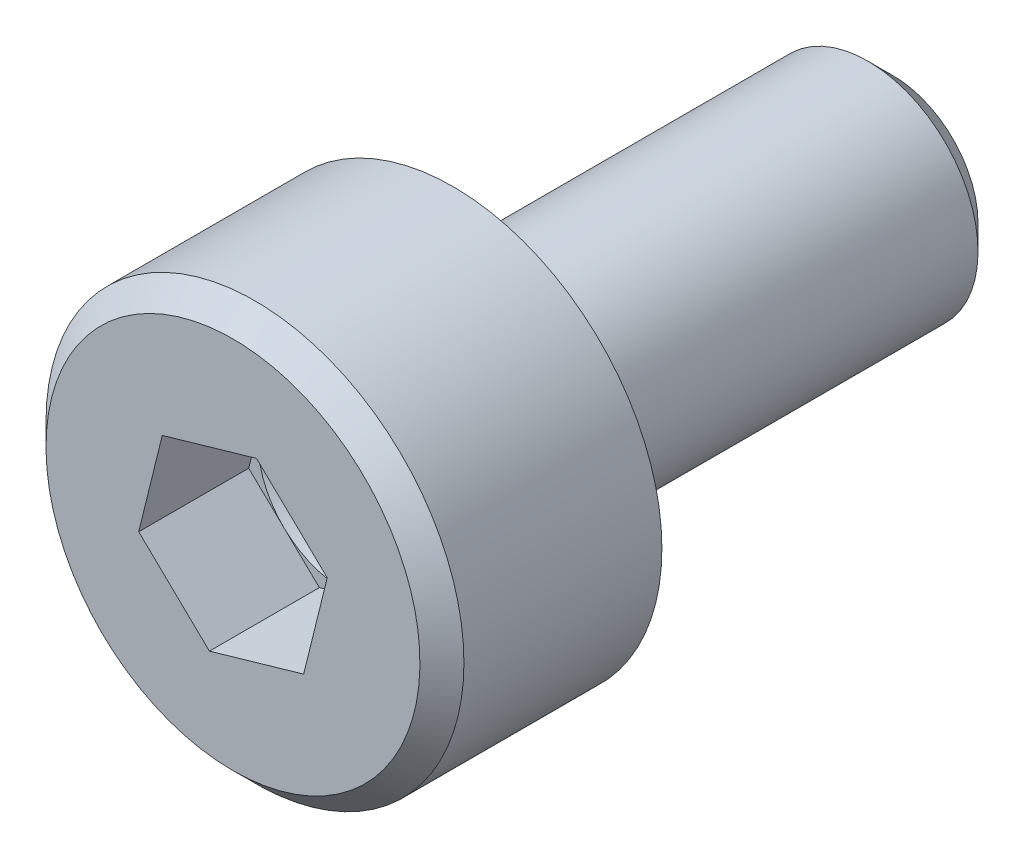
ISO-10303-21;
HEADER;
FILE_DESCRIPTION(('STEP AP214'),'2;1');
FILE_NAME('part.step','',(''),(''),'','','');
FILE_SCHEMA(('AUTOMOTIVE_DESIGN { 1 0 10303 214 1 1 1 1 }'));
ENDSEC;
DATA;
#1=APPLICATION_CONTEXT('core data for automotive mechanical design processes');
#2=APPLICATION_PROTOCOL_DEFINITION('international standard','automotive_design',2000,#1);
#3=PRODUCT_CONTEXT('',#1,'mechanical');
#4=PRODUCT('Part','Part','',(#3));
#5=PRODUCT_RELATED_PRODUCT_CATEGORY('part','',(#4));
#6=PRODUCT_DEFINITION_FORMATION('','',#4);
#7=PRODUCT_DEFINITION_CONTEXT('part definition',#1,'design');
#8=PRODUCT_DEFINITION('design','',#6,#7);
#9=PRODUCT_DEFINITION_SHAPE('','',#8);
#10=(LENGTH_UNIT() NAMED_UNIT(*) SI_UNIT(.MILLI.,.METRE.));
#11=(NAMED_UNIT(*) PLANE_ANGLE_UNIT() SI_UNIT($,.RADIAN.));
#12=(NAMED_UNIT(*) SI_UNIT($,.STERADIAN.) SOLID_ANGLE_UNIT());
#13=UNCERTAINTY_MEASURE_WITH_UNIT(LENGTH_MEASURE(1.E-05),#10,'distance_accuracy_value','');
#14=(GEOMETRIC_REPRESENTATION_CONTEXT(3) GLOBAL_UNCERTAINTY_ASSIGNED_CONTEXT((#13)) GLOBAL_UNIT_ASSIGNED_CONTEXT((#10,
#11,#12)) REPRESENTATION_CONTEXT('',''));
#15=CARTESIAN_POINT('',(0.,0.,0.));
#16=DIRECTION('',(0.,0.,1.));
#17=DIRECTION('',(1.,0.,0.));
#18=AXIS2_PLACEMENT_3D('',#15,#16,#17);
#19=CARTESIAN_POINT('',(15.2383327942925,-4.87782878444803,9.1));
#20=DIRECTION('',(0.,0.,-1.));
#21=DIRECTION('',(0.,1.,0.));
#22=AXIS2_PLACEMENT_3D('',#19,#20,#21);
#23=TOROIDAL_SURFACE('',#22,1.10000000000004,0.100000000000027);
#24=CARTESIAN_POINT('',(15.2383327942925,-4.87782878444803,9.2));
#25=DIRECTION('',(0.,0.,1.));
#26=DIRECTION('',(0.,1.,0.));
#27=AXIS2_PLACEMENT_3D('',#24,#25,#26);
#28=CIRCLE('',#27,1.1);
#29=CARTESIAN_POINT('',(16.3061327451744,-5.14203185955639,9.2));
#30=VERTEX_POINT('',#29);
#31=CARTESIAN_POINT('',(14.1705328434106,-4.61362570933967,9.2));
#32=VERTEX_POINT('',#31);
#33=EDGE_CURVE('E272',#30,#32,#28,.T.);
#34=ORIENTED_EDGE('',*,*,#33,.F.);
#35=CARTESIAN_POINT('',(16.3061327451744,-5.14203185955639,9.1));
#36=DIRECTION('',(-0.240184613734874,-0.970727228074411,0.));
#37=DIRECTION('',(0.970727228074411,-0.240184613734874,0.));
#38=AXIS2_PLACEMENT_3D('',#35,#36,#37);
#39=CIRCLE('',#38,0.1);
#40=CARTESIAN_POINT('',(16.2090600223669,-5.1180133981829,9.1));
#41=VERTEX_POINT('',#40);
#42=EDGE_CURVE('E279',#30,#41,#39,.T.);
#43=ORIENTED_EDGE('',*,*,#42,.T.);
#44=CARTESIAN_POINT('',(15.2383327942925,-4.87782878444803,9.1));
#45=DIRECTION('',(0.,0.,-1.));
#46=DIRECTION('',(0.97072722807441,-0.240184613734876,0.));
#47=AXIS2_PLACEMENT_3D('',#44,#45,#46);
#48=CIRCLE('',#47,1.);
#49=CARTESIAN_POINT('',(14.2676055662181,-4.63764417071315,9.1));
#50=VERTEX_POINT('',#49);
#51=EDGE_CURVE('E11',#50,#41,#48,.T.);
#52=ORIENTED_EDGE('',*,*,#51,.F.);
#53=CARTESIAN_POINT('',(14.1705328434106,-4.61362570933967,9.1));
#54=DIRECTION('',(0.240184613734878,0.97072722807441,0.));
#55=DIRECTION('',(-0.97072722807441,0.240184613734878,0.));
#56=AXIS2_PLACEMENT_3D('',#53,#54,#55);
#57=CIRCLE('',#56,0.1);
#58=EDGE_CURVE('E199',#32,#50,#57,.T.);
#59=ORIENTED_EDGE('',*,*,#58,.F.);
#60=EDGE_LOOP('',(#34,#43,#52,#59));
#61=FACE_BOUND('',#60,.T.);
#62=ADVANCED_FACE('F16',(#61),#23,.F.);
#63=CARTESIAN_POINT('',(15.2383327942925,-4.87782878444803,42.95));
#64=DIRECTION('',(0.,0.,1.));
#65=DIRECTION('',(0.97072722807441,-0.240184613734876,0.));
#66=AXIS2_PLACEMENT_3D('',#63,#64,#65);
#67=CYLINDRICAL_SURFACE('',#66,1.);
#68=CARTESIAN_POINT('',(15.2383327942925,-4.87782878444803,5.426));
#69=DIRECTION('',(0.,0.,1.));
#70=DIRECTION('',(0.97072722807441,-0.240184613734876,0.));
#71=AXIS2_PLACEMENT_3D('',#68,#69,#70);
#72=CIRCLE('',#71,1.);
#73=CARTESIAN_POINT('',(16.2090600223669,-5.11801339818291,5.426));
#74=VERTEX_POINT('',#73);
#75=EDGE_CURVE('E19',#74,#74,#72,.T.);
#76=ORIENTED_EDGE('',*,*,#75,.T.);
#77=EDGE_LOOP('',(#76));
#78=FACE_BOUND('',#77,.T.);
#79=ORIENTED_EDGE('',*,*,#51,.T.);
#80=CARTESIAN_POINT('',(15.2383327942925,-4.87782878444803,9.1));
#81=DIRECTION('',(0.,0.,-1.));
#82=DIRECTION('',(0.97072722807441,-0.240184613734876,0.));
#83=AXIS2_PLACEMENT_3D('',#80,#81,#82);
#84=CIRCLE('',#83,1.);
#85=EDGE_CURVE('E194',#41,#50,#84,.T.);
#86=ORIENTED_EDGE('',*,*,#85,.T.);
#87=EDGE_LOOP('',(#79,#86));
#88=FACE_BOUND('',#87,.T.);
#89=ADVANCED_FACE('F508',(#78,#88),#67,.T.);
#90=CARTESIAN_POINT('',(15.2383327942925,-4.87782878444803,5.42599999991234));
#91=DIRECTION('',(0.,0.,1.));
#92=DIRECTION('',(0.970727228074411,-0.240184613734875,0.));
#93=AXIS2_PLACEMENT_3D('',#90,#91,#92);
#94=CONICAL_SURFACE('',#93,0.999999999919511,0.785398163397448);
#95=CARTESIAN_POINT('',(15.2383327942925,-4.87782878444803,5.19999999997134));
#96=DIRECTION('',(0.,0.,1.));
#97=DIRECTION('',(0.97072722807441,-0.240184613734876,0.));
#98=AXIS2_PLACEMENT_3D('',#95,#96,#97);
#99=CIRCLE('',#98,0.773999999978514);
#100=CARTESIAN_POINT('',(15.9896756688012,-5.06373167547366,5.19999999997134));
#101=VERTEX_POINT('',#100);
#102=EDGE_CURVE('E265',#101,#101,#99,.T.);
#103=ORIENTED_EDGE('',*,*,#102,.T.);
#104=EDGE_LOOP('',(#103));
#105=FACE_BOUND('',#104,.T.);
#106=ORIENTED_EDGE('',*,*,#75,.F.);
#107=EDGE_LOOP('',(#106));
#108=FACE_BOUND('',#107,.T.);
#109=ADVANCED_FACE('F498',(#105,#108),#94,.T.);
#110=CARTESIAN_POINT('',(15.2383327942925,-4.87782878444803,42.95));
#111=DIRECTION('',(0.,0.,1.));
#112=DIRECTION('',(0.97072722807441,-0.240184613734876,0.));
#113=AXIS2_PLACEMENT_3D('',#110,#111,#112);
#114=CYLINDRICAL_SURFACE('',#113,1.9);
#115=CARTESIAN_POINT('',(15.2383327942925,-4.87782878444803,9.2));
#116=DIRECTION('',(0.,0.,-1.));
#117=DIRECTION('',(0.97072722807441,-0.240184613734876,0.));
#118=AXIS2_PLACEMENT_3D('',#115,#116,#117);
#119=CIRCLE('',#118,1.9);
#120=CARTESIAN_POINT('',(17.0827145276339,-5.33417955054429,9.2));
#121=VERTEX_POINT('',#120);
#122=EDGE_CURVE('E276',#121,#121,#119,.T.);
#123=ORIENTED_EDGE('',*,*,#122,.F.);
#124=EDGE_LOOP('',(#123));
#125=FACE_BOUND('',#124,.T.);
#126=CARTESIAN_POINT('',(15.2383327942925,-4.87782878444803,11.));
#127=DIRECTION('',(0.,0.,-1.));
#128=DIRECTION('',(0.97072722807441,-0.240184613734876,0.));
#129=AXIS2_PLACEMENT_3D('',#126,#127,#128);
#130=CIRCLE('',#129,1.9);
#131=CARTESIAN_POINT('',(17.0827145276339,-5.33417955054429,11.));
#132=VERTEX_POINT('',#131);
#133=EDGE_CURVE('E198',#132,#132,#130,.T.);
#134=ORIENTED_EDGE('',*,*,#133,.T.);
#135=EDGE_LOOP('',(#134));
#136=FACE_BOUND('',#135,.T.);
#137=ADVANCED_FACE('F487',(#125,#136),#114,.T.);
#138=CARTESIAN_POINT('',(15.2383327942925,-4.87782878444803,10.9999999999933));
#139=DIRECTION('',(0.,0.,-1.));
#140=DIRECTION('',(-0.97072722807441,0.240184613734876,0.));
#141=AXIS2_PLACEMENT_3D('',#138,#139,#140);
#142=CONICAL_SURFACE('',#141,1.89999999997781,0.78539816325534);
#143=CARTESIAN_POINT('',(15.2383327942925,-4.87782878444803,11.2000000000568));
#144=DIRECTION('',(0.,0.,-1.));
#145=DIRECTION('',(-0.97072722807441,0.240184613734876,0.));
#146=AXIS2_PLACEMENT_3D('',#143,#144,#145);
#147=CIRCLE('',#146,1.69999999997117);
#148=CARTESIAN_POINT('',(13.588096506594,-4.46951494110567,11.2000000000568));
#149=VERTEX_POINT('',#148);
#150=EDGE_CURVE('E262',#149,#149,#147,.T.);
#151=ORIENTED_EDGE('',*,*,#150,.T.);
#152=EDGE_LOOP('',(#151));
#153=FACE_BOUND('',#152,.T.);
#154=ORIENTED_EDGE('',*,*,#133,.F.);
#155=EDGE_LOOP('',(#154));
#156=FACE_BOUND('',#155,.T.);
#157=ADVANCED_FACE('F477',(#153,#156),#142,.T.);
#158=CARTESIAN_POINT('',(15.2383327942925,-4.87782878444803,10.1999999999668));
#159=DIRECTION('',(0.,0.,1.));
#160=DIRECTION('',(0.970727228074411,-0.240184613734875,0.));
#161=AXIS2_PLACEMENT_3D('',#158,#159,#160);
#162=CONICAL_SURFACE('',#161,0.772499999868614,1.04719755118058);
#163=CARTESIAN_POINT('',(15.2383327944028,-4.87782878447533,9.75399691705314));
#164=VERTEX_POINT('',#163);
#165=VERTEX_LOOP('',#164);
#166=FACE_BOUND('',#165,.T.);
#167=CARTESIAN_POINT('',(15.2383327942925,-4.87782878444803,10.2000000000324));
#168=DIRECTION('',(0.,0.,1.));
#169=DIRECTION('',(0.97072722807441,-0.240184613734876,0.));
#170=AXIS2_PLACEMENT_3D('',#167,#168,#169);
#171=CIRCLE('',#170,0.772499999982302);
#172=CARTESIAN_POINT('',(15.0240740197552,-4.13563647276587,10.2000000000162));
#173=VERTEX_POINT('',#172);
#174=CARTESIAN_POINT('',(14.4884460106367,-4.69228617034644,10.2000000000079));
#175=VERTEX_POINT('',#174);
#176=EDGE_CURVE('E156',#173,#175,#171,.T.);
#177=ORIENTED_EDGE('',*,*,#176,.T.);
#178=CARTESIAN_POINT('',(15.2383327942925,-4.87782878444803,10.2000000000324));
#179=DIRECTION('',(0.,0.,1.));
#180=DIRECTION('',(0.97072722807441,-0.240184613734876,0.));
#181=AXIS2_PLACEMENT_3D('',#178,#179,#180);
#182=CIRCLE('',#181,0.772499999982302);
#183=CARTESIAN_POINT('',(14.7027047851509,-5.43447848202212,10.2000000000162));
#184=VERTEX_POINT('',#183);
#185=EDGE_CURVE('E148',#175,#184,#182,.T.);
#186=ORIENTED_EDGE('',*,*,#185,.T.);
#187=CARTESIAN_POINT('',(15.2383327942925,-4.87782878444803,10.2000000000324));
#188=DIRECTION('',(0.,0.,1.));
#189=DIRECTION('',(0.97072722807441,-0.240184613734876,0.));
#190=AXIS2_PLACEMENT_3D('',#187,#188,#189);
#191=CIRCLE('',#190,0.772499999982302);
#192=CARTESIAN_POINT('',(15.4525915688298,-5.62002109613019,10.2000000000162));
#193=VERTEX_POINT('',#192);
#194=EDGE_CURVE('E152',#184,#193,#191,.T.);
#195=ORIENTED_EDGE('',*,*,#194,.T.);
#196=CARTESIAN_POINT('',(15.2383327942925,-4.87782878444803,10.2000000000324));
#197=DIRECTION('',(0.,0.,1.));
#198=DIRECTION('',(0.97072722807441,-0.240184613734876,0.));
#199=AXIS2_PLACEMENT_3D('',#196,#197,#198);
#200=CIRCLE('',#199,0.772499999982302);
#201=CARTESIAN_POINT('',(15.9882195779481,-5.06337139855033,10.2000000000079));
#202=VERTEX_POINT('',#201);
#203=EDGE_CURVE('E587',#193,#202,#200,.T.);
#204=ORIENTED_EDGE('',*,*,#203,.T.);
#205=CARTESIAN_POINT('',(15.2383327942925,-4.87782878444803,10.2000000000324));
#206=DIRECTION('',(0.,0.,1.));
#207=DIRECTION('',(0.97072722807441,-0.240184613734876,0.));
#208=AXIS2_PLACEMENT_3D('',#205,#206,#207);
#209=CIRCLE('',#208,0.772499999982302);
#210=CARTESIAN_POINT('',(15.7739608034341,-4.32117908687393,10.2000000000162));
#211=VERTEX_POINT('',#210);
#212=EDGE_CURVE('E577',#202,#211,#209,.T.);
#213=ORIENTED_EDGE('',*,*,#212,.T.);
#214=CARTESIAN_POINT('',(15.2383327942925,-4.87782878444803,10.2000000000324));
#215=DIRECTION('',(0.,0.,1.));
#216=DIRECTION('',(0.97072722807441,-0.240184613734876,0.));
#217=AXIS2_PLACEMENT_3D('',#214,#215,#216);
#218=CIRCLE('',#217,0.772499999982302);
#219=EDGE_CURVE('E214',#211,#173,#218,.T.);
#220=ORIENTED_EDGE('',*,*,#219,.T.);
#221=EDGE_LOOP('',(#177,#186,#195,#204,#213,#220));
#222=FACE_BOUND('',#221,.T.);
#223=ADVANCED_FACE('F150',(#166,#222),#162,.F.);
#224=CARTESIAN_POINT('',(15.2383327942925,-4.87782878444803,9.1));
#225=DIRECTION('',(0.,0.,-1.));
#226=DIRECTION('',(0.,1.,0.));
#227=AXIS2_PLACEMENT_3D('',#224,#225,#226);
#228=TOROIDAL_SURFACE('',#227,1.10000000000004,0.100000000000037);
#229=ORIENTED_EDGE('',*,*,#42,.F.);
#230=CARTESIAN_POINT('',(15.2383327942925,-4.87782878444803,9.2));
#231=DIRECTION('',(0.,0.,1.));
#232=DIRECTION('',(-1.,0.,0.));
#233=AXIS2_PLACEMENT_3D('',#230,#231,#232);
#234=CIRCLE('',#233,1.1);
#235=EDGE_CURVE('E268',#32,#30,#234,.T.);
#236=ORIENTED_EDGE('',*,*,#235,.F.);
#237=ORIENTED_EDGE('',*,*,#58,.T.);
#238=ORIENTED_EDGE('',*,*,#85,.F.);
#239=EDGE_LOOP('',(#229,#236,#237,#238));
#240=FACE_BOUND('',#239,.T.);
#241=ADVANCED_FACE('F458',(#240),#228,.F.);
#242=CARTESIAN_POINT('',(15.6946835603888,-3.03344705110665,9.2));
#243=DIRECTION('',(0.,0.,-1.));
#244=DIRECTION('',(0.,-1.,0.));
#245=AXIS2_PLACEMENT_3D('',#242,#243,#244);
#246=PLANE('',#245);
#247=ORIENTED_EDGE('',*,*,#122,.T.);
#248=EDGE_LOOP('',(#247));
#249=FACE_BOUND('',#248,.T.);
#250=ORIENTED_EDGE('',*,*,#235,.T.);
#251=ORIENTED_EDGE('',*,*,#33,.T.);
#252=EDGE_LOOP('',(#250,#251));
#253=FACE_BOUND('',#252,.T.);
#254=ADVANCED_FACE('F447',(#249,#253),#246,.T.);
#255=CARTESIAN_POINT('',(15.4242356853233,-4.12648590991843,5.2));
#256=DIRECTION('',(0.,0.,-1.));
#257=DIRECTION('',(0.,-1.,0.));
#258=AXIS2_PLACEMENT_3D('',#255,#256,#257);
#259=PLANE('',#258);
#260=ORIENTED_EDGE('',*,*,#102,.F.);
#261=EDGE_LOOP('',(#260));
#262=FACE_BOUND('',#261,.T.);
#263=ADVANCED_FACE('F436',(#262),#259,.T.);
#264=CARTESIAN_POINT('',(15.2383327942925,-4.87782878444803,11.2));
#265=DIRECTION('',(0.,0.,1.));
#266=DIRECTION('',(1.,0.,0.));
#267=AXIS2_PLACEMENT_3D('',#264,#265,#266);
#268=PLANE('',#267);
#269=ORIENTED_EDGE('',*,*,#150,.F.);
#270=EDGE_LOOP('',(#269));
#271=FACE_BOUND('',#270,.T.);
#272=DIRECTION('',(0.240184613734876,0.97072722807441,0.));
#273=VECTOR('',#272,1.);
#274=CARTESIAN_POINT('',(14.488446010605,-4.69228617033784,11.2));
#275=LINE('',#274,#273);
#276=CARTESIAN_POINT('',(14.3813229324024,-5.12523350676155,11.2));
#277=VERTEX_POINT('',#276);
#278=CARTESIAN_POINT('',(14.5955690888077,-4.25933883391413,11.2));
#279=VERTEX_POINT('',#278);
#280=EDGE_CURVE('E207',#277,#279,#275,.T.);
#281=ORIENTED_EDGE('',*,*,#280,.T.);
#282=DIRECTION('',(0.960766746525128,0.277357636944651,0.));
#283=VECTOR('',#282,1.);
#284=CARTESIAN_POINT('',(14.5955690888077,-4.25933883391413,11.2));
#285=LINE('',#284,#283);
#286=CARTESIAN_POINT('',(15.4525789506979,-4.01193411160061,11.2));
#287=VERTEX_POINT('',#286);
#288=EDGE_CURVE('E259',#279,#287,#285,.T.);
#289=ORIENTED_EDGE('',*,*,#288,.T.);
#290=DIRECTION('',(0.720582132790253,-0.69336959112976,0.));
#291=VECTOR('',#290,1.);
#292=CARTESIAN_POINT('',(15.4525789506979,-4.01193411160061,11.2));
#293=LINE('',#292,#291);
#294=CARTESIAN_POINT('',(16.0953426561827,-4.63042406213451,11.2));
#295=VERTEX_POINT('',#294);
#296=EDGE_CURVE('E230',#287,#295,#293,.T.);
#297=ORIENTED_EDGE('',*,*,#296,.T.);
#298=DIRECTION('',(-0.240184613734876,-0.97072722807441,0.));
#299=VECTOR('',#298,1.);
#300=CARTESIAN_POINT('',(15.98821957798,-5.06337139855822,11.2));
#301=LINE('',#300,#299);
#302=CARTESIAN_POINT('',(15.8810964997773,-5.49631873498193,11.2));
#303=VERTEX_POINT('',#302);
#304=EDGE_CURVE('E240',#295,#303,#301,.T.);
#305=ORIENTED_EDGE('',*,*,#304,.T.);
#306=DIRECTION('',(-0.960766746525128,-0.277357636944651,0.));
#307=VECTOR('',#306,1.);
#308=CARTESIAN_POINT('',(15.8810964997773,-5.49631873498193,11.2));
#309=LINE('',#308,#307);
#310=CARTESIAN_POINT('',(15.0240866378872,-5.74372345729545,11.2));
#311=VERTEX_POINT('',#310);
#312=EDGE_CURVE('E246',#303,#311,#309,.T.);
#313=ORIENTED_EDGE('',*,*,#312,.T.);
#314=DIRECTION('',(-0.720582132790253,0.69336959112976,0.));
#315=VECTOR('',#314,1.);
#316=CARTESIAN_POINT('',(15.0240866378872,-5.74372345729545,11.2));
#317=LINE('',#316,#315);
#318=EDGE_CURVE('E208',#311,#277,#317,.T.);
#319=ORIENTED_EDGE('',*,*,#318,.T.);
#320=EDGE_LOOP('',(#281,#289,#297,#305,#313,#319));
#321=FACE_BOUND('',#320,.T.);
#322=ADVANCED_FACE('F426',(#271,#321),#268,.T.);
#323=CARTESIAN_POINT('',(15.4525789506979,-4.01193411160061,10.2));
#324=DIRECTION('',(-0.277357636944651,0.960766746525128,0.));
#325=DIRECTION('',(0.,0.,1.));
#326=AXIS2_PLACEMENT_3D('',#323,#324,#325);
#327=PLANE('',#326);
#328=DIRECTION('',(0.,0.,1.));
#329=VECTOR('',#328,1.);
#330=CARTESIAN_POINT('',(14.5955690888077,-4.25933883391413,10.2));
#331=LINE('',#330,#329);
#332=CARTESIAN_POINT('',(14.5955690888077,-4.25933883391413,10.2));
#333=VERTEX_POINT('',#332);
#334=EDGE_CURVE('E203',#333,#279,#331,.T.);
#335=ORIENTED_EDGE('',*,*,#334,.F.);
#336=DIRECTION('',(-0.960766746525128,-0.277357636944651,0.));
#337=VECTOR('',#336,1.);
#338=CARTESIAN_POINT('',(15.4525789506979,-4.01193411160061,10.2));
#339=LINE('',#338,#337);
#340=EDGE_CURVE('E220',#173,#333,#339,.T.);
#341=ORIENTED_EDGE('',*,*,#340,.F.);
#342=DIRECTION('',(-0.960766746525128,-0.277357636944651,0.));
#343=VECTOR('',#342,1.);
#344=CARTESIAN_POINT('',(15.4525789506979,-4.01193411160061,10.2));
#345=LINE('',#344,#343);
#346=CARTESIAN_POINT('',(15.4525789506979,-4.01193411160061,10.2));
#347=VERTEX_POINT('',#346);
#348=EDGE_CURVE('E211',#347,#173,#345,.T.);
#349=ORIENTED_EDGE('',*,*,#348,.F.);
#350=DIRECTION('',(0.,0.,-1.));
#351=VECTOR('',#350,1.);
#352=CARTESIAN_POINT('',(15.4525789506979,-4.01193411160061,10.2));
#353=LINE('',#352,#351);
#354=EDGE_CURVE('E234',#287,#347,#353,.T.);
#355=ORIENTED_EDGE('',*,*,#354,.F.);
#356=ORIENTED_EDGE('',*,*,#288,.F.);
#357=EDGE_LOOP('',(#335,#341,#349,#355,#356));
#358=FACE_BOUND('',#357,.T.);
#359=ADVANCED_FACE('F415',(#358),#327,.F.);
#360=CARTESIAN_POINT('',(14.5955690888077,-4.25933883391413,10.2));
#361=DIRECTION('',(-0.970727228074411,0.240184613734874,0.));
#362=DIRECTION('',(0.,0.,1.));
#363=AXIS2_PLACEMENT_3D('',#360,#361,#362);
#364=PLANE('',#363);
#365=DIRECTION('',(0.,0.,1.));
#366=VECTOR('',#365,1.);
#367=CARTESIAN_POINT('',(14.3813229324024,-5.12523350676155,10.2));
#368=LINE('',#367,#366);
#369=CARTESIAN_POINT('',(14.3813229324024,-5.12523350676155,10.2));
#370=VERTEX_POINT('',#369);
#371=EDGE_CURVE('E250',#370,#277,#368,.T.);
#372=ORIENTED_EDGE('',*,*,#371,.F.);
#373=DIRECTION('',(-0.240184613734874,-0.970727228074411,0.));
#374=VECTOR('',#373,1.);
#375=CARTESIAN_POINT('',(14.5955690888077,-4.25933883391413,10.2));
#376=LINE('',#375,#374);
#377=EDGE_CURVE('E161',#175,#370,#376,.T.);
#378=ORIENTED_EDGE('',*,*,#377,.F.);
#379=DIRECTION('',(-0.240184613734874,-0.970727228074411,0.));
#380=VECTOR('',#379,1.);
#381=CARTESIAN_POINT('',(14.5955690888077,-4.25933883391413,10.2));
#382=LINE('',#381,#380);
#383=EDGE_CURVE('E200',#333,#175,#382,.T.);
#384=ORIENTED_EDGE('',*,*,#383,.F.);
#385=ORIENTED_EDGE('',*,*,#334,.T.);
#386=ORIENTED_EDGE('',*,*,#280,.F.);
#387=EDGE_LOOP('',(#372,#378,#384,#385,#386));
#388=FACE_BOUND('',#387,.T.);
#389=ADVANCED_FACE('F405',(#388),#364,.F.);
#390=CARTESIAN_POINT('',(15.0240866378872,-5.74372345729545,10.2));
#391=DIRECTION('',(0.69336959112976,0.720582132790253,0.));
#392=DIRECTION('',(0.,0.,-1.));
#393=AXIS2_PLACEMENT_3D('',#390,#391,#392);
#394=PLANE('',#393);
#395=DIRECTION('',(-0.720582132790253,0.69336959112976,0.));
#396=VECTOR('',#395,1.);
#397=CARTESIAN_POINT('',(15.0240866378872,-5.74372345729545,10.2));
#398=LINE('',#397,#396);
#399=EDGE_CURVE('E162',#184,#370,#398,.T.);
#400=ORIENTED_EDGE('',*,*,#399,.T.);
#401=ORIENTED_EDGE('',*,*,#371,.T.);
#402=ORIENTED_EDGE('',*,*,#318,.F.);
#403=DIRECTION('',(0.,0.,-1.));
#404=VECTOR('',#403,1.);
#405=CARTESIAN_POINT('',(15.0240866378872,-5.74372345729545,10.2));
#406=LINE('',#405,#404);
#407=CARTESIAN_POINT('',(15.0240866378872,-5.74372345729545,10.2));
#408=VERTEX_POINT('',#407);
#409=EDGE_CURVE('E176',#311,#408,#406,.T.);
#410=ORIENTED_EDGE('',*,*,#409,.T.);
#411=DIRECTION('',(-0.720582132790253,0.69336959112976,0.));
#412=VECTOR('',#411,1.);
#413=CARTESIAN_POINT('',(15.0240866378872,-5.74372345729545,10.2));
#414=LINE('',#413,#412);
#415=EDGE_CURVE('E171',#408,#184,#414,.T.);
#416=ORIENTED_EDGE('',*,*,#415,.T.);
#417=EDGE_LOOP('',(#400,#401,#402,#410,#416));
#418=FACE_BOUND('',#417,.T.);
#419=ADVANCED_FACE('F174',(#418),#394,.T.);
#420=CARTESIAN_POINT('',(15.8810964997773,-5.49631873498193,10.2));
#421=DIRECTION('',(-0.277357636944651,0.960766746525128,0.));
#422=DIRECTION('',(0.,0.,1.));
#423=AXIS2_PLACEMENT_3D('',#420,#421,#422);
#424=PLANE('',#423);
#425=DIRECTION('',(-0.960766746525128,-0.277357636944651,0.));
#426=VECTOR('',#425,1.);
#427=CARTESIAN_POINT('',(15.8810964997773,-5.49631873498193,10.2));
#428=LINE('',#427,#426);
#429=EDGE_CURVE('E182',#193,#408,#428,.T.);
#430=ORIENTED_EDGE('',*,*,#429,.T.);
#431=ORIENTED_EDGE('',*,*,#409,.F.);
#432=ORIENTED_EDGE('',*,*,#312,.F.);
#433=DIRECTION('',(0.,0.,-1.));
#434=VECTOR('',#433,1.);
#435=CARTESIAN_POINT('',(15.8810964997773,-5.49631873498193,10.2));
#436=LINE('',#435,#434);
#437=CARTESIAN_POINT('',(15.8810964997773,-5.49631873498193,10.2));
#438=VERTEX_POINT('',#437);
#439=EDGE_CURVE('E237',#303,#438,#436,.T.);
#440=ORIENTED_EDGE('',*,*,#439,.T.);
#441=DIRECTION('',(-0.960766746525128,-0.277357636944651,0.));
#442=VECTOR('',#441,1.);
#443=CARTESIAN_POINT('',(15.8810964997773,-5.49631873498193,10.2));
#444=LINE('',#443,#442);
#445=EDGE_CURVE('E190',#438,#193,#444,.T.);
#446=ORIENTED_EDGE('',*,*,#445,.T.);
#447=EDGE_LOOP('',(#430,#431,#432,#440,#446));
#448=FACE_BOUND('',#447,.T.);
#449=ADVANCED_FACE('F382',(#448),#424,.T.);
#450=CARTESIAN_POINT('',(15.8810964997773,-5.49631873498193,10.2));
#451=DIRECTION('',(0.970727228074411,-0.240184613734874,0.));
#452=DIRECTION('',(0.,0.,-1.));
#453=AXIS2_PLACEMENT_3D('',#450,#451,#452);
#454=PLANE('',#453);
#455=DIRECTION('',(0.,0.,1.));
#456=VECTOR('',#455,1.);
#457=CARTESIAN_POINT('',(16.0953426561827,-4.63042406213451,10.2));
#458=LINE('',#457,#456);
#459=CARTESIAN_POINT('',(16.0953426561827,-4.63042406213451,10.2));
#460=VERTEX_POINT('',#459);
#461=EDGE_CURVE('E226',#460,#295,#458,.T.);
#462=ORIENTED_EDGE('',*,*,#461,.F.);
#463=DIRECTION('',(0.240184613734874,0.970727228074411,0.));
#464=VECTOR('',#463,1.);
#465=CARTESIAN_POINT('',(15.8810964997773,-5.49631873498193,10.2));
#466=LINE('',#465,#464);
#467=EDGE_CURVE('E594',#202,#460,#466,.T.);
#468=ORIENTED_EDGE('',*,*,#467,.F.);
#469=DIRECTION('',(0.240184613734874,0.970727228074411,0.));
#470=VECTOR('',#469,1.);
#471=CARTESIAN_POINT('',(15.8810964997773,-5.49631873498193,10.2));
#472=LINE('',#471,#470);
#473=EDGE_CURVE('E584',#438,#202,#472,.T.);
#474=ORIENTED_EDGE('',*,*,#473,.F.);
#475=ORIENTED_EDGE('',*,*,#439,.F.);
#476=ORIENTED_EDGE('',*,*,#304,.F.);
#477=EDGE_LOOP('',(#462,#468,#474,#475,#476));
#478=FACE_BOUND('',#477,.T.);
#479=ADVANCED_FACE('F371',(#478),#454,.F.);
#480=CARTESIAN_POINT('',(15.4525789506979,-4.01193411160061,10.2));
#481=DIRECTION('',(-0.69336959112976,-0.720582132790253,0.));
#482=DIRECTION('',(-0.720582132790253,0.69336959112976,0.));
#483=AXIS2_PLACEMENT_3D('',#480,#481,#482);
#484=PLANE('',#483);
#485=DIRECTION('',(0.720582132790253,-0.69336959112976,0.));
#486=VECTOR('',#485,1.);
#487=CARTESIAN_POINT('',(15.4525789506979,-4.01193411160061,10.2));
#488=LINE('',#487,#486);
#489=EDGE_CURVE('E600',#211,#460,#488,.T.);
#490=ORIENTED_EDGE('',*,*,#489,.T.);
#491=ORIENTED_EDGE('',*,*,#461,.T.);
#492=ORIENTED_EDGE('',*,*,#296,.F.);
#493=ORIENTED_EDGE('',*,*,#354,.T.);
#494=DIRECTION('',(0.720582132790253,-0.69336959112976,0.));
#495=VECTOR('',#494,1.);
#496=CARTESIAN_POINT('',(15.4525789506979,-4.01193411160061,10.2));
#497=LINE('',#496,#495);
#498=EDGE_CURVE('E137',#347,#211,#497,.T.);
#499=ORIENTED_EDGE('',*,*,#498,.T.);
#500=EDGE_LOOP('',(#490,#491,#492,#493,#499));
#501=FACE_BOUND('',#500,.T.);
#502=ADVANCED_FACE('F361',(#501),#484,.T.);
#503=CARTESIAN_POINT('',(16.7381063616675,-5.24891401266841,10.2));
#504=DIRECTION('',(0.,0.,-1.));
#505=DIRECTION('',(0.,-1.,0.));
#506=AXIS2_PLACEMENT_3D('',#503,#504,#505);
#507=PLANE('',#506);
#508=ORIENTED_EDGE('',*,*,#383,.T.);
#509=ORIENTED_EDGE('',*,*,#176,.F.);
#510=ORIENTED_EDGE('',*,*,#340,.T.);
#511=EDGE_LOOP('',(#508,#509,#510));
#512=FACE_BOUND('',#511,.T.);
#513=ADVANCED_FACE('F350',(#512),#507,.F.);
#514=CARTESIAN_POINT('',(16.7381063616675,-5.24891401266841,10.2));
#515=DIRECTION('',(0.,0.,-1.));
#516=DIRECTION('',(0.,-1.,0.));
#517=AXIS2_PLACEMENT_3D('',#514,#515,#516);
#518=PLANE('',#517);
#519=ORIENTED_EDGE('',*,*,#348,.T.);
#520=ORIENTED_EDGE('',*,*,#219,.F.);
#521=ORIENTED_EDGE('',*,*,#498,.F.);
#522=EDGE_LOOP('',(#519,#520,#521));
#523=FACE_BOUND('',#522,.T.);
#524=ADVANCED_FACE('F339',(#523),#518,.F.);
#525=CARTESIAN_POINT('',(16.7381063616675,-5.24891401266841,10.2));
#526=DIRECTION('',(0.,0.,-1.));
#527=DIRECTION('',(0.,-1.,0.));
#528=AXIS2_PLACEMENT_3D('',#525,#526,#527);
#529=PLANE('',#528);
#530=ORIENTED_EDGE('',*,*,#399,.F.);
#531=ORIENTED_EDGE('',*,*,#185,.F.);
#532=ORIENTED_EDGE('',*,*,#377,.T.);
#533=EDGE_LOOP('',(#530,#531,#532));
#534=FACE_BOUND('',#533,.T.);
#535=ADVANCED_FACE('F166',(#534),#529,.F.);
#536=CARTESIAN_POINT('',(16.7381063616675,-5.24891401266841,10.2));
#537=DIRECTION('',(0.,0.,-1.));
#538=DIRECTION('',(0.,-1.,0.));
#539=AXIS2_PLACEMENT_3D('',#536,#537,#538);
#540=PLANE('',#539);
#541=ORIENTED_EDGE('',*,*,#429,.F.);
#542=ORIENTED_EDGE('',*,*,#194,.F.);
#543=ORIENTED_EDGE('',*,*,#415,.F.);
#544=EDGE_LOOP('',(#541,#542,#543));
#545=FACE_BOUND('',#544,.T.);
#546=ADVANCED_FACE('F181',(#545),#540,.F.);
#547=CARTESIAN_POINT('',(16.7381063616675,-5.24891401266841,10.2));
#548=DIRECTION('',(0.,0.,-1.));
#549=DIRECTION('',(0.,-1.,0.));
#550=AXIS2_PLACEMENT_3D('',#547,#548,#549);
#551=PLANE('',#550);
#552=ORIENTED_EDGE('',*,*,#473,.T.);
#553=ORIENTED_EDGE('',*,*,#203,.F.);
#554=ORIENTED_EDGE('',*,*,#445,.F.);
#555=EDGE_LOOP('',(#552,#553,#554));
#556=FACE_BOUND('',#555,.T.);
#557=ADVANCED_FACE('F307',(#556),#551,.F.);
#558=CARTESIAN_POINT('',(16.7381063616675,-5.24891401266841,10.2));
#559=DIRECTION('',(0.,0.,-1.));
#560=DIRECTION('',(0.,-1.,0.));
#561=AXIS2_PLACEMENT_3D('',#558,#559,#560);
#562=PLANE('',#561);
#563=ORIENTED_EDGE('',*,*,#489,.F.);
#564=ORIENTED_EDGE('',*,*,#212,.F.);
#565=ORIENTED_EDGE('',*,*,#467,.T.);
#566=EDGE_LOOP('',(#563,#564,#565));
#567=FACE_BOUND('',#566,.T.);
#568=ADVANCED_FACE('F302',(#567),#562,.F.);
#569=CLOSED_SHELL('',(#62,#89,#109,#137,#157,#223,#241,#254,#263,#322,#359,#389,#419,#449,#479,
#502,#513,#524,#535,#546,#557,#568));
#570=MANIFOLD_SOLID_BREP('B1',#569);
#571=ADVANCED_BREP_SHAPE_REPRESENTATION('',(#18,#570),#14);
#572=SHAPE_DEFINITION_REPRESENTATION(#9,#571);
ENDSEC;
END-ISO-10303-21;
